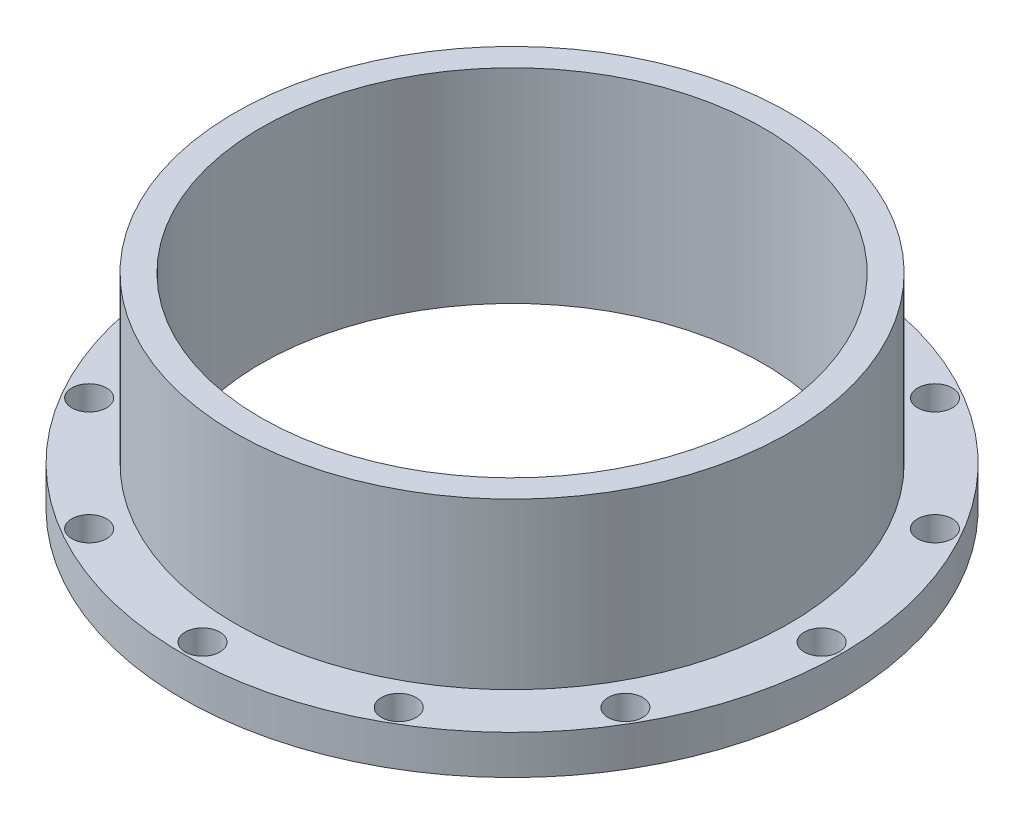
ISO-10303-21;
HEADER;
FILE_DESCRIPTION(('STEP AP214'),'2;1');
FILE_NAME('part.step','',(''),(''),'','','');
FILE_SCHEMA(('AUTOMOTIVE_DESIGN { 1 0 10303 214 1 1 1 1 }'));
ENDSEC;
DATA;
#1=APPLICATION_CONTEXT('core data for automotive mechanical design processes');
#2=APPLICATION_PROTOCOL_DEFINITION('international standard','automotive_design',2000,#1);
#3=PRODUCT_CONTEXT('',#1,'mechanical');
#4=PRODUCT('Part','Part','',(#3));
#5=PRODUCT_RELATED_PRODUCT_CATEGORY('part','',(#4));
#6=PRODUCT_DEFINITION_FORMATION('','',#4);
#7=PRODUCT_DEFINITION_CONTEXT('part definition',#1,'design');
#8=PRODUCT_DEFINITION('design','',#6,#7);
#9=PRODUCT_DEFINITION_SHAPE('','',#8);
#10=(LENGTH_UNIT() NAMED_UNIT(*) SI_UNIT(.MILLI.,.METRE.));
#11=(NAMED_UNIT(*) PLANE_ANGLE_UNIT() SI_UNIT($,.RADIAN.));
#12=(NAMED_UNIT(*) SI_UNIT($,.STERADIAN.) SOLID_ANGLE_UNIT());
#13=UNCERTAINTY_MEASURE_WITH_UNIT(LENGTH_MEASURE(1.E-05),#10,'distance_accuracy_value','');
#14=(GEOMETRIC_REPRESENTATION_CONTEXT(3) GLOBAL_UNCERTAINTY_ASSIGNED_CONTEXT((#13)) GLOBAL_UNIT_ASSIGNED_CONTEXT((#10,
#11,#12)) REPRESENTATION_CONTEXT('',''));
#15=CARTESIAN_POINT('',(0.,0.,0.));
#16=DIRECTION('',(0.,0.,1.));
#17=DIRECTION('',(1.,0.,0.));
#18=AXIS2_PLACEMENT_3D('',#15,#16,#17);
#19=CARTESIAN_POINT('',(0.,30.48,0.));
#20=DIRECTION('',(0.,-1.,0.));
#21=DIRECTION('',(0.,0.,-1.));
#22=AXIS2_PLACEMENT_3D('',#19,#20,#21);
#23=CYLINDRICAL_SURFACE('',#22,49.2125);
#24=CARTESIAN_POINT('',(0.,0.,0.));
#25=DIRECTION('',(0.,1.,0.));
#26=DIRECTION('',(0.,0.,1.));
#27=AXIS2_PLACEMENT_3D('',#24,#25,#26);
#28=CIRCLE('',#27,49.2125);
#29=CARTESIAN_POINT('',(0.,0.,-49.2125));
#30=VERTEX_POINT('',#29);
#31=EDGE_CURVE('E11',#30,#30,#28,.T.);
#32=CARTESIAN_POINT('',(0.,5.842,0.));
#33=DIRECTION('',(0.,1.,0.));
#34=DIRECTION('',(0.,0.,1.));
#35=AXIS2_PLACEMENT_3D('',#32,#33,#34);
#36=CIRCLE('',#35,49.2125);
#37=CARTESIAN_POINT('',(0.,5.84199999999999,-49.2125));
#38=VERTEX_POINT('',#37);
#39=EDGE_CURVE('E49',#38,#38,#36,.T.);
#40=CARTESIAN_POINT('',(0.,0.,-49.2125));
#41=CARTESIAN_POINT('',(0.,0.0608541666666669,-49.2125));
#42=CARTESIAN_POINT('',(0.,0.121708333333334,-49.2125));
#43=CARTESIAN_POINT('',(0.,0.243416666666667,-49.2125));
#44=CARTESIAN_POINT('',(0.,0.304270833333334,-49.2125));
#45=CARTESIAN_POINT('',(0.,0.425979166666667,-49.2125));
#46=CARTESIAN_POINT('',(0.,0.486833333333332,-49.2125));
#47=CARTESIAN_POINT('',(0.,0.608541666666665,-49.2125));
#48=CARTESIAN_POINT('',(0.,0.669395833333331,-49.2125));
#49=CARTESIAN_POINT('',(0.,0.791104166666665,-49.2125));
#50=CARTESIAN_POINT('',(0.,0.851958333333332,-49.2125));
#51=CARTESIAN_POINT('',(0.,0.973666666666666,-49.2125));
#52=CARTESIAN_POINT('',(0.,1.03452083333333,-49.2125));
#53=CARTESIAN_POINT('',(0.,1.15622916666667,-49.2125));
#54=CARTESIAN_POINT('',(0.,1.21708333333333,-49.2125));
#55=CARTESIAN_POINT('',(0.,1.33879166666667,-49.2125));
#56=CARTESIAN_POINT('',(0.,1.39964583333333,-49.2125));
#57=CARTESIAN_POINT('',(0.,1.52135416666666,-49.2125));
#58=CARTESIAN_POINT('',(0.,1.58220833333333,-49.2125));
#59=CARTESIAN_POINT('',(0.,1.70391666666666,-49.2125));
#60=CARTESIAN_POINT('',(0.,1.76477083333333,-49.2125));
#61=CARTESIAN_POINT('',(0.,1.88647916666666,-49.2125));
#62=CARTESIAN_POINT('',(0.,1.94733333333333,-49.2125));
#63=CARTESIAN_POINT('',(0.,2.06904166666666,-49.2125));
#64=CARTESIAN_POINT('',(0.,2.12989583333333,-49.2125));
#65=CARTESIAN_POINT('',(0.,2.25160416666666,-49.2125));
#66=CARTESIAN_POINT('',(0.,2.31245833333333,-49.2125));
#67=CARTESIAN_POINT('',(0.,2.43416666666666,-49.2125));
#68=CARTESIAN_POINT('',(0.,2.49502083333333,-49.2125));
#69=CARTESIAN_POINT('',(0.,2.61672916666666,-49.2125));
#70=CARTESIAN_POINT('',(0.,2.67758333333333,-49.2125));
#71=CARTESIAN_POINT('',(0.,2.79929166666666,-49.2125));
#72=CARTESIAN_POINT('',(0.,2.86014583333333,-49.2125));
#73=CARTESIAN_POINT('',(0.,2.98185416666666,-49.2125));
#74=CARTESIAN_POINT('',(0.,3.04270833333333,-49.2125));
#75=CARTESIAN_POINT('',(0.,3.16441666666666,-49.2125));
#76=CARTESIAN_POINT('',(0.,3.22527083333333,-49.2125));
#77=CARTESIAN_POINT('',(0.,3.34697916666666,-49.2125));
#78=CARTESIAN_POINT('',(0.,3.40783333333333,-49.2125));
#79=CARTESIAN_POINT('',(0.,3.52954166666666,-49.2125));
#80=CARTESIAN_POINT('',(0.,3.59039583333333,-49.2125));
#81=CARTESIAN_POINT('',(0.,3.71210416666666,-49.2125));
#82=CARTESIAN_POINT('',(0.,3.77295833333333,-49.2125));
#83=CARTESIAN_POINT('',(0.,3.89466666666666,-49.2125));
#84=CARTESIAN_POINT('',(0.,3.95552083333333,-49.2125));
#85=CARTESIAN_POINT('',(0.,4.07722916666666,-49.2125));
#86=CARTESIAN_POINT('',(0.,4.13808333333333,-49.2125));
#87=CARTESIAN_POINT('',(0.,4.25979166666666,-49.2125));
#88=CARTESIAN_POINT('',(0.,4.32064583333333,-49.2125));
#89=CARTESIAN_POINT('',(0.,4.44235416666666,-49.2125));
#90=CARTESIAN_POINT('',(0.,4.50320833333333,-49.2125));
#91=CARTESIAN_POINT('',(0.,4.62491666666666,-49.2125));
#92=CARTESIAN_POINT('',(0.,4.68577083333333,-49.2125));
#93=CARTESIAN_POINT('',(0.,4.80747916666666,-49.2125));
#94=CARTESIAN_POINT('',(0.,4.86833333333333,-49.2125));
#95=CARTESIAN_POINT('',(0.,4.99004166666666,-49.2125));
#96=CARTESIAN_POINT('',(0.,5.05089583333333,-49.2125));
#97=CARTESIAN_POINT('',(0.,5.17260416666666,-49.2125));
#98=CARTESIAN_POINT('',(0.,5.23345833333333,-49.2125));
#99=CARTESIAN_POINT('',(0.,5.35516666666666,-49.2125));
#100=CARTESIAN_POINT('',(0.,5.41602083333333,-49.2125));
#101=CARTESIAN_POINT('',(0.,5.53772916666666,-49.2125));
#102=CARTESIAN_POINT('',(0.,5.59858333333333,-49.2125));
#103=CARTESIAN_POINT('',(0.,5.72029166666666,-49.2125));
#104=CARTESIAN_POINT('',(0.,5.78114583333333,-49.2125));
#105=CARTESIAN_POINT('',(0.,5.84199999999999,-49.2125));
#106=B_SPLINE_CURVE_WITH_KNOTS('',3,(#40,#41,#42,#43,#44,#45,#46,#47,#48,#49,#50,#51,#52,#53,
#54,#55,#56,#57,#58,#59,#60,#61,#62,#63,#64,#65,#66,#67,#68,#69,#70,#71,#72,#73,#74,#75,#76,#77,
#78,#79,#80,#81,#82,#83,#84,#85,#86,#87,#88,#89,#90,#91,#92,#93,#94,#95,#96,#97,#98,#99,#100,
#101,#102,#103,#104,#105),.UNSPECIFIED.,.F.,.F.,(4,2,2,2,2,2,2,2,2,2,2,2,2,2,2,2,2,2,2,2,2,2,2,
2,2,2,2,2,2,2,2,2,4),(0.,0.1825625,0.365125000000001,0.547687499999998,0.730249999999998,
0.912812499999999,1.095375,1.2779375,1.4605,1.6430625,1.825625,2.0081875,2.19075,2.3733125,
2.555875,2.7384375,2.921,3.1035625,3.286125,3.4686875,3.65124999999999,3.8338125,4.016375,
4.1989375,4.3815,4.56406249999999,4.74662499999999,4.92918749999999,5.11174999999999,
5.29431249999999,5.47687499999999,5.65943749999999,5.84199999999999),.UNSPECIFIED.);
#107=EDGE_CURVE('BSEAM46',#30,#38,#106,.T.);
#108=ORIENTED_EDGE('',*,*,#31,.T.);
#109=ORIENTED_EDGE('',*,*,#39,.F.);
#110=ORIENTED_EDGE('',*,*,#107,.T.);
#111=ORIENTED_EDGE('',*,*,#107,.F.);
#112=EDGE_LOOP('',(#108,#110,#109,#111));
#113=FACE_BOUND('',#112,.T.);
#114=ADVANCED_FACE('F46',(#113),#23,.T.);
#115=CARTESIAN_POINT('',(0.,0.,0.));
#116=DIRECTION('',(0.,1.,0.));
#117=DIRECTION('',(0.,0.,1.));
#118=AXIS2_PLACEMENT_3D('',#115,#116,#117);
#119=PLANE('',#118);
#120=CARTESIAN_POINT('',(-23.1139999999995,0.,-40.0346223661473));
#121=DIRECTION('',(0.,1.,0.));
#122=DIRECTION('',(0.,0.,1.));
#123=AXIS2_PLACEMENT_3D('',#120,#121,#122);
#124=CIRCLE('',#123,2.5908);
#125=CARTESIAN_POINT('',(-23.1139999999995,0.,-37.4438223661473));
#126=VERTEX_POINT('',#125);
#127=EDGE_CURVE('E163',#126,#126,#124,.T.);
#128=ORIENTED_EDGE('',*,*,#127,.T.);
#129=EDGE_LOOP('',(#128));
#130=FACE_BOUND('',#129,.T.);
#131=CARTESIAN_POINT('',(-40.0346223661468,0.,-23.1140000000005));
#132=DIRECTION('',(0.,1.,0.));
#133=DIRECTION('',(0.,0.,1.));
#134=AXIS2_PLACEMENT_3D('',#131,#132,#133);
#135=CIRCLE('',#134,2.5908);
#136=CARTESIAN_POINT('',(-40.0346223661468,0.,-20.5232000000005));
#137=VERTEX_POINT('',#136);
#138=EDGE_CURVE('E155',#137,#137,#135,.T.);
#139=ORIENTED_EDGE('',*,*,#138,.T.);
#140=EDGE_LOOP('',(#139));
#141=FACE_BOUND('',#140,.T.);
#142=CARTESIAN_POINT('',(-46.228,0.,-4.84212597996121E-13));
#143=DIRECTION('',(0.,1.,0.));
#144=DIRECTION('',(0.,0.,1.));
#145=AXIS2_PLACEMENT_3D('',#142,#143,#144);
#146=CIRCLE('',#145,2.5908);
#147=CARTESIAN_POINT('',(-46.228,0.,2.59079999999951));
#148=VERTEX_POINT('',#147);
#149=EDGE_CURVE('E147',#148,#148,#146,.T.);
#150=ORIENTED_EDGE('',*,*,#149,.T.);
#151=EDGE_LOOP('',(#150));
#152=FACE_BOUND('',#151,.T.);
#153=CARTESIAN_POINT('',(-40.0346223661472,0.,23.1139999999996));
#154=DIRECTION('',(0.,1.,0.));
#155=DIRECTION('',(0.,0.,1.));
#156=AXIS2_PLACEMENT_3D('',#153,#154,#155);
#157=CIRCLE('',#156,2.5908);
#158=CARTESIAN_POINT('',(-40.0346223661472,0.,25.7047999999996));
#159=VERTEX_POINT('',#158);
#160=EDGE_CURVE('E139',#159,#159,#157,.T.);
#161=ORIENTED_EDGE('',*,*,#160,.T.);
#162=EDGE_LOOP('',(#161));
#163=FACE_BOUND('',#162,.T.);
#164=CARTESIAN_POINT('',(-23.1140000000003,0.,40.0346223661468));
#165=DIRECTION('',(0.,1.,0.));
#166=DIRECTION('',(0.,0.,1.));
#167=AXIS2_PLACEMENT_3D('',#164,#165,#166);
#168=CIRCLE('',#167,2.5908);
#169=CARTESIAN_POINT('',(-23.1140000000003,0.,42.6254223661468));
#170=VERTEX_POINT('',#169);
#171=EDGE_CURVE('E131',#170,#170,#168,.T.);
#172=ORIENTED_EDGE('',*,*,#171,.T.);
#173=EDGE_LOOP('',(#172));
#174=FACE_BOUND('',#173,.T.);
#175=CARTESIAN_POINT('',(0.,0.,46.228));
#176=DIRECTION('',(0.,1.,0.));
#177=DIRECTION('',(0.,0.,1.));
#178=AXIS2_PLACEMENT_3D('',#175,#176,#177);
#179=CIRCLE('',#178,2.5908);
#180=CARTESIAN_POINT('',(0.,0.,48.8188));
#181=VERTEX_POINT('',#180);
#182=EDGE_CURVE('E123',#181,#181,#179,.T.);
#183=ORIENTED_EDGE('',*,*,#182,.T.);
#184=EDGE_LOOP('',(#183));
#185=FACE_BOUND('',#184,.T.);
#186=CARTESIAN_POINT('',(23.1139999999998,0.,40.0346223661472));
#187=DIRECTION('',(0.,1.,0.));
#188=DIRECTION('',(0.,0.,1.));
#189=AXIS2_PLACEMENT_3D('',#186,#187,#188);
#190=CIRCLE('',#189,2.5908);
#191=CARTESIAN_POINT('',(23.1139999999998,0.,42.6254223661472));
#192=VERTEX_POINT('',#191);
#193=EDGE_CURVE('E115',#192,#192,#190,.T.);
#194=ORIENTED_EDGE('',*,*,#193,.T.);
#195=EDGE_LOOP('',(#194));
#196=FACE_BOUND('',#195,.T.);
#197=CARTESIAN_POINT('',(40.0346223661469,0.,23.1140000000002));
#198=DIRECTION('',(0.,1.,0.));
#199=DIRECTION('',(0.,0.,1.));
#200=AXIS2_PLACEMENT_3D('',#197,#198,#199);
#201=CIRCLE('',#200,2.5908);
#202=CARTESIAN_POINT('',(40.0346223661469,0.,25.7048000000002));
#203=VERTEX_POINT('',#202);
#204=EDGE_CURVE('E107',#203,#203,#201,.T.);
#205=ORIENTED_EDGE('',*,*,#204,.T.);
#206=EDGE_LOOP('',(#205));
#207=FACE_BOUND('',#206,.T.);
#208=CARTESIAN_POINT('',(46.228,0.,1.6140419933204E-13));
#209=DIRECTION('',(0.,1.,0.));
#210=DIRECTION('',(0.,0.,1.));
#211=AXIS2_PLACEMENT_3D('',#208,#209,#210);
#212=CIRCLE('',#211,2.5908);
#213=CARTESIAN_POINT('',(46.228,0.,2.59080000000016));
#214=VERTEX_POINT('',#213);
#215=EDGE_CURVE('E99',#214,#214,#212,.T.);
#216=ORIENTED_EDGE('',*,*,#215,.T.);
#217=EDGE_LOOP('',(#216));
#218=FACE_BOUND('',#217,.T.);
#219=CARTESIAN_POINT('',(40.0346223661471,0.,-23.1139999999999));
#220=DIRECTION('',(0.,1.,0.));
#221=DIRECTION('',(0.,0.,1.));
#222=AXIS2_PLACEMENT_3D('',#219,#220,#221);
#223=CIRCLE('',#222,2.5908);
#224=CARTESIAN_POINT('',(40.0346223661471,0.,-20.5231999999999));
#225=VERTEX_POINT('',#224);
#226=EDGE_CURVE('E91',#225,#225,#223,.T.);
#227=ORIENTED_EDGE('',*,*,#226,.T.);
#228=EDGE_LOOP('',(#227));
#229=FACE_BOUND('',#228,.T.);
#230=CARTESIAN_POINT('',(23.114,0.,-40.034622366147));
#231=DIRECTION('',(0.,1.,0.));
#232=DIRECTION('',(0.,0.,1.));
#233=AXIS2_PLACEMENT_3D('',#230,#231,#232);
#234=CIRCLE('',#233,2.5908);
#235=CARTESIAN_POINT('',(23.114,0.,-37.443822366147));
#236=VERTEX_POINT('',#235);
#237=EDGE_CURVE('E83',#236,#236,#234,.T.);
#238=ORIENTED_EDGE('',*,*,#237,.T.);
#239=EDGE_LOOP('',(#238));
#240=FACE_BOUND('',#239,.T.);
#241=CARTESIAN_POINT('',(0.,0.,-46.228));
#242=DIRECTION('',(0.,1.,0.));
#243=DIRECTION('',(0.,0.,1.));
#244=AXIS2_PLACEMENT_3D('',#241,#242,#243);
#245=CIRCLE('',#244,2.5908);
#246=CARTESIAN_POINT('',(0.,0.,-43.6372));
#247=VERTEX_POINT('',#246);
#248=EDGE_CURVE('E72',#247,#247,#245,.T.);
#249=ORIENTED_EDGE('',*,*,#248,.T.);
#250=EDGE_LOOP('',(#249));
#251=FACE_BOUND('',#250,.T.);
#252=CARTESIAN_POINT('',(0.,0.,0.));
#253=DIRECTION('',(0.,1.,0.));
#254=DIRECTION('',(0.,0.,1.));
#255=AXIS2_PLACEMENT_3D('',#252,#253,#254);
#256=CIRCLE('',#255,37.5);
#257=CARTESIAN_POINT('',(0.,0.,37.5));
#258=VERTEX_POINT('',#257);
#259=EDGE_CURVE('E64',#258,#258,#256,.T.);
#260=ORIENTED_EDGE('',*,*,#259,.T.);
#261=EDGE_LOOP('',(#260));
#262=FACE_BOUND('',#261,.T.);
#263=ORIENTED_EDGE('',*,*,#31,.F.);
#264=EDGE_LOOP('',(#263));
#265=FACE_BOUND('',#264,.T.);
#266=ADVANCED_FACE('F178',(#130,#141,#152,#163,#174,#185,#196,#207,#218,#229,#240,#251,#262,
#265),#119,.F.);
#267=CARTESIAN_POINT('',(0.,5.842,0.));
#268=DIRECTION('',(0.,1.,0.));
#269=DIRECTION('',(0.,0.,1.));
#270=AXIS2_PLACEMENT_3D('',#267,#268,#269);
#271=PLANE('',#270);
#272=CARTESIAN_POINT('',(-23.1139999999995,5.842,-40.0346223661473));
#273=DIRECTION('',(0.,1.,0.));
#274=DIRECTION('',(0.,0.,1.));
#275=AXIS2_PLACEMENT_3D('',#272,#273,#274);
#276=CIRCLE('',#275,2.59079999999999);
#277=CARTESIAN_POINT('',(-23.1139999999995,5.842,-37.4438223661473));
#278=VERTEX_POINT('',#277);
#279=EDGE_CURVE('E167',#278,#278,#276,.T.);
#280=ORIENTED_EDGE('',*,*,#279,.F.);
#281=EDGE_LOOP('',(#280));
#282=FACE_BOUND('',#281,.T.);
#283=CARTESIAN_POINT('',(-40.0346223661468,5.842,-23.1140000000005));
#284=DIRECTION('',(0.,1.,0.));
#285=DIRECTION('',(0.,0.,1.));
#286=AXIS2_PLACEMENT_3D('',#283,#284,#285);
#287=CIRCLE('',#286,2.59079999999999);
#288=CARTESIAN_POINT('',(-40.0346223661468,5.842,-20.5232000000005));
#289=VERTEX_POINT('',#288);
#290=EDGE_CURVE('E159',#289,#289,#287,.T.);
#291=ORIENTED_EDGE('',*,*,#290,.F.);
#292=EDGE_LOOP('',(#291));
#293=FACE_BOUND('',#292,.T.);
#294=CARTESIAN_POINT('',(-46.228,5.842,-4.84212597996121E-13));
#295=DIRECTION('',(0.,1.,0.));
#296=DIRECTION('',(0.,0.,1.));
#297=AXIS2_PLACEMENT_3D('',#294,#295,#296);
#298=CIRCLE('',#297,2.59079999999998);
#299=CARTESIAN_POINT('',(-46.228,5.842,2.5907999999995));
#300=VERTEX_POINT('',#299);
#301=EDGE_CURVE('E151',#300,#300,#298,.T.);
#302=ORIENTED_EDGE('',*,*,#301,.F.);
#303=EDGE_LOOP('',(#302));
#304=FACE_BOUND('',#303,.T.);
#305=CARTESIAN_POINT('',(-40.0346223661472,5.842,23.1139999999996));
#306=DIRECTION('',(0.,1.,0.));
#307=DIRECTION('',(0.,0.,1.));
#308=AXIS2_PLACEMENT_3D('',#305,#306,#307);
#309=CIRCLE('',#308,2.59079999999999);
#310=CARTESIAN_POINT('',(-40.0346223661472,5.842,25.7047999999996));
#311=VERTEX_POINT('',#310);
#312=EDGE_CURVE('E143',#311,#311,#309,.T.);
#313=ORIENTED_EDGE('',*,*,#312,.F.);
#314=EDGE_LOOP('',(#313));
#315=FACE_BOUND('',#314,.T.);
#316=CARTESIAN_POINT('',(-23.1140000000003,5.842,40.0346223661468));
#317=DIRECTION('',(0.,1.,0.));
#318=DIRECTION('',(0.,0.,1.));
#319=AXIS2_PLACEMENT_3D('',#316,#317,#318);
#320=CIRCLE('',#319,2.59079999999999);
#321=CARTESIAN_POINT('',(-23.1140000000003,5.842,42.6254223661468));
#322=VERTEX_POINT('',#321);
#323=EDGE_CURVE('E135',#322,#322,#320,.T.);
#324=ORIENTED_EDGE('',*,*,#323,.F.);
#325=EDGE_LOOP('',(#324));
#326=FACE_BOUND('',#325,.T.);
#327=CARTESIAN_POINT('',(0.,5.842,46.228));
#328=DIRECTION('',(0.,1.,0.));
#329=DIRECTION('',(0.,0.,1.));
#330=AXIS2_PLACEMENT_3D('',#327,#328,#329);
#331=CIRCLE('',#330,2.59079999999999);
#332=CARTESIAN_POINT('',(0.,5.842,48.8188));
#333=VERTEX_POINT('',#332);
#334=EDGE_CURVE('E127',#333,#333,#331,.T.);
#335=ORIENTED_EDGE('',*,*,#334,.F.);
#336=EDGE_LOOP('',(#335));
#337=FACE_BOUND('',#336,.T.);
#338=CARTESIAN_POINT('',(23.1139999999998,5.842,40.0346223661472));
#339=DIRECTION('',(0.,1.,0.));
#340=DIRECTION('',(0.,0.,1.));
#341=AXIS2_PLACEMENT_3D('',#338,#339,#340);
#342=CIRCLE('',#341,2.59079999999999);
#343=CARTESIAN_POINT('',(23.1139999999998,5.842,42.6254223661471));
#344=VERTEX_POINT('',#343);
#345=EDGE_CURVE('E119',#344,#344,#342,.T.);
#346=ORIENTED_EDGE('',*,*,#345,.F.);
#347=EDGE_LOOP('',(#346));
#348=FACE_BOUND('',#347,.T.);
#349=CARTESIAN_POINT('',(40.0346223661469,5.842,23.1140000000002));
#350=DIRECTION('',(0.,1.,0.));
#351=DIRECTION('',(0.,0.,1.));
#352=AXIS2_PLACEMENT_3D('',#349,#350,#351);
#353=CIRCLE('',#352,2.59079999999998);
#354=CARTESIAN_POINT('',(40.0346223661469,5.842,25.7048000000002));
#355=VERTEX_POINT('',#354);
#356=EDGE_CURVE('E111',#355,#355,#353,.T.);
#357=ORIENTED_EDGE('',*,*,#356,.F.);
#358=EDGE_LOOP('',(#357));
#359=FACE_BOUND('',#358,.T.);
#360=CARTESIAN_POINT('',(46.228,5.842,1.6140419933204E-13));
#361=DIRECTION('',(0.,1.,0.));
#362=DIRECTION('',(0.,0.,1.));
#363=AXIS2_PLACEMENT_3D('',#360,#361,#362);
#364=CIRCLE('',#363,2.59079999999998);
#365=CARTESIAN_POINT('',(46.228,5.842,2.59080000000014));
#366=VERTEX_POINT('',#365);
#367=EDGE_CURVE('E103',#366,#366,#364,.T.);
#368=ORIENTED_EDGE('',*,*,#367,.F.);
#369=EDGE_LOOP('',(#368));
#370=FACE_BOUND('',#369,.T.);
#371=CARTESIAN_POINT('',(40.0346223661471,5.842,-23.1139999999999));
#372=DIRECTION('',(0.,1.,0.));
#373=DIRECTION('',(0.,0.,1.));
#374=AXIS2_PLACEMENT_3D('',#371,#372,#373);
#375=CIRCLE('',#374,2.59079999999998);
#376=CARTESIAN_POINT('',(40.0346223661471,5.842,-20.5231999999999));
#377=VERTEX_POINT('',#376);
#378=EDGE_CURVE('E95',#377,#377,#375,.T.);
#379=ORIENTED_EDGE('',*,*,#378,.F.);
#380=EDGE_LOOP('',(#379));
#381=FACE_BOUND('',#380,.T.);
#382=CARTESIAN_POINT('',(23.114,5.842,-40.034622366147));
#383=DIRECTION('',(0.,1.,0.));
#384=DIRECTION('',(0.,0.,1.));
#385=AXIS2_PLACEMENT_3D('',#382,#383,#384);
#386=CIRCLE('',#385,2.59079999999999);
#387=CARTESIAN_POINT('',(23.114,5.842,-37.443822366147));
#388=VERTEX_POINT('',#387);
#389=EDGE_CURVE('E87',#388,#388,#386,.T.);
#390=ORIENTED_EDGE('',*,*,#389,.F.);
#391=EDGE_LOOP('',(#390));
#392=FACE_BOUND('',#391,.T.);
#393=CARTESIAN_POINT('',(0.,5.842,-46.228));
#394=DIRECTION('',(0.,1.,0.));
#395=DIRECTION('',(0.,0.,1.));
#396=AXIS2_PLACEMENT_3D('',#393,#394,#395);
#397=CIRCLE('',#396,2.59079999999999);
#398=CARTESIAN_POINT('',(0.,5.842,-43.6372));
#399=VERTEX_POINT('',#398);
#400=EDGE_CURVE('E79',#399,#399,#397,.T.);
#401=ORIENTED_EDGE('',*,*,#400,.F.);
#402=EDGE_LOOP('',(#401));
#403=FACE_BOUND('',#402,.T.);
#404=CARTESIAN_POINT('',(0.,5.842,0.));
#405=DIRECTION('',(0.,1.,0.));
#406=DIRECTION('',(0.,0.,1.));
#407=AXIS2_PLACEMENT_3D('',#404,#405,#406);
#408=CIRCLE('',#407,41.402);
#409=CARTESIAN_POINT('',(0.,5.842,41.402));
#410=VERTEX_POINT('',#409);
#411=EDGE_CURVE('E58',#410,#410,#408,.T.);
#412=ORIENTED_EDGE('',*,*,#411,.F.);
#413=EDGE_LOOP('',(#412));
#414=FACE_BOUND('',#413,.T.);
#415=ORIENTED_EDGE('',*,*,#39,.T.);
#416=EDGE_LOOP('',(#415));
#417=FACE_BOUND('',#416,.T.);
#418=ADVANCED_FACE('F174',(#282,#293,#304,#315,#326,#337,#348,#359,#370,#381,#392,#403,#414,
#417),#271,.T.);
#419=CARTESIAN_POINT('',(0.,5.842,0.));
#420=DIRECTION('',(0.,1.,0.));
#421=DIRECTION('',(0.,0.,1.));
#422=AXIS2_PLACEMENT_3D('',#419,#420,#421);
#423=CYLINDRICAL_SURFACE('',#422,41.402);
#424=CARTESIAN_POINT('',(0.,30.48,0.));
#425=DIRECTION('',(0.,1.,0.));
#426=DIRECTION('',(0.,0.,1.));
#427=AXIS2_PLACEMENT_3D('',#424,#425,#426);
#428=CIRCLE('',#427,41.402);
#429=CARTESIAN_POINT('',(0.,30.48,41.402));
#430=VERTEX_POINT('',#429);
#431=EDGE_CURVE('E60',#430,#430,#428,.T.);
#432=CARTESIAN_POINT('',(0.,5.842,41.402));
#433=CARTESIAN_POINT('',(0.,6.09864583333333,41.402));
#434=CARTESIAN_POINT('',(0.,6.35529166666666,41.402));
#435=CARTESIAN_POINT('',(0.,6.86858333333333,41.402));
#436=CARTESIAN_POINT('',(0.,7.12522916666666,41.402));
#437=CARTESIAN_POINT('',(0.,7.63852083333333,41.402));
#438=CARTESIAN_POINT('',(0.,7.89516666666666,41.402));
#439=CARTESIAN_POINT('',(0.,8.40845833333333,41.402));
#440=CARTESIAN_POINT('',(0.,8.66510416666666,41.402));
#441=CARTESIAN_POINT('',(0.,9.17839583333333,41.402));
#442=CARTESIAN_POINT('',(0.,9.43504166666666,41.402));
#443=CARTESIAN_POINT('',(0.,9.94833333333333,41.402));
#444=CARTESIAN_POINT('',(0.,10.2049791666667,41.402));
#445=CARTESIAN_POINT('',(0.,10.7182708333333,41.402));
#446=CARTESIAN_POINT('',(0.,10.9749166666667,41.402));
#447=CARTESIAN_POINT('',(0.,11.4882083333333,41.402));
#448=CARTESIAN_POINT('',(0.,11.7448541666667,41.402));
#449=CARTESIAN_POINT('',(0.,12.2581458333333,41.402));
#450=CARTESIAN_POINT('',(0.,12.5147916666667,41.402));
#451=CARTESIAN_POINT('',(0.,13.0280833333333,41.402));
#452=CARTESIAN_POINT('',(0.,13.2847291666667,41.402));
#453=CARTESIAN_POINT('',(0.,13.7980208333333,41.402));
#454=CARTESIAN_POINT('',(0.,14.0546666666667,41.402));
#455=CARTESIAN_POINT('',(0.,14.5679583333333,41.402));
#456=CARTESIAN_POINT('',(0.,14.8246041666667,41.402));
#457=CARTESIAN_POINT('',(0.,15.3378958333333,41.402));
#458=CARTESIAN_POINT('',(0.,15.5945416666667,41.402));
#459=CARTESIAN_POINT('',(0.,16.1078333333333,41.402));
#460=CARTESIAN_POINT('',(0.,16.3644791666667,41.402));
#461=CARTESIAN_POINT('',(0.,16.8777708333333,41.402));
#462=CARTESIAN_POINT('',(0.,17.1344166666667,41.402));
#463=CARTESIAN_POINT('',(0.,17.6477083333333,41.402));
#464=CARTESIAN_POINT('',(0.,17.9043541666667,41.402));
#465=CARTESIAN_POINT('',(0.,18.4176458333333,41.402));
#466=CARTESIAN_POINT('',(0.,18.6742916666667,41.402));
#467=CARTESIAN_POINT('',(0.,19.1875833333333,41.402));
#468=CARTESIAN_POINT('',(0.,19.4442291666667,41.402));
#469=CARTESIAN_POINT('',(0.,19.9575208333333,41.402));
#470=CARTESIAN_POINT('',(0.,20.2141666666667,41.402));
#471=CARTESIAN_POINT('',(0.,20.7274583333333,41.402));
#472=CARTESIAN_POINT('',(0.,20.9841041666667,41.402));
#473=CARTESIAN_POINT('',(0.,21.4973958333333,41.402));
#474=CARTESIAN_POINT('',(0.,21.7540416666667,41.402));
#475=CARTESIAN_POINT('',(0.,22.2673333333333,41.402));
#476=CARTESIAN_POINT('',(0.,22.5239791666667,41.402));
#477=CARTESIAN_POINT('',(0.,23.0372708333333,41.402));
#478=CARTESIAN_POINT('',(0.,23.2939166666667,41.402));
#479=CARTESIAN_POINT('',(0.,23.8072083333333,41.402));
#480=CARTESIAN_POINT('',(0.,24.0638541666667,41.402));
#481=CARTESIAN_POINT('',(0.,24.5771458333333,41.402));
#482=CARTESIAN_POINT('',(0.,24.8337916666667,41.402));
#483=CARTESIAN_POINT('',(0.,25.3470833333333,41.402));
#484=CARTESIAN_POINT('',(0.,25.6037291666667,41.402));
#485=CARTESIAN_POINT('',(0.,26.1170208333333,41.402));
#486=CARTESIAN_POINT('',(0.,26.3736666666667,41.402));
#487=CARTESIAN_POINT('',(0.,26.8869583333333,41.402));
#488=CARTESIAN_POINT('',(0.,27.1436041666667,41.402));
#489=CARTESIAN_POINT('',(0.,27.6568958333333,41.402));
#490=CARTESIAN_POINT('',(0.,27.9135416666667,41.402));
#491=CARTESIAN_POINT('',(0.,28.4268333333333,41.402));
#492=CARTESIAN_POINT('',(0.,28.6834791666667,41.402));
#493=CARTESIAN_POINT('',(0.,29.1967708333333,41.402));
#494=CARTESIAN_POINT('',(0.,29.4534166666667,41.402));
#495=CARTESIAN_POINT('',(0.,29.9667083333333,41.402));
#496=CARTESIAN_POINT('',(0.,30.2233541666667,41.402));
#497=CARTESIAN_POINT('',(0.,30.48,41.402));
#498=B_SPLINE_CURVE_WITH_KNOTS('',3,(#432,#433,#434,#435,#436,#437,#438,#439,#440,#441,#442,
#443,#444,#445,#446,#447,#448,#449,#450,#451,#452,#453,#454,#455,#456,#457,#458,#459,#460,#461,
#462,#463,#464,#465,#466,#467,#468,#469,#470,#471,#472,#473,#474,#475,#476,#477,#478,#479,#480,
#481,#482,#483,#484,#485,#486,#487,#488,#489,#490,#491,#492,#493,#494,#495,#496,#497),
.UNSPECIFIED.,.F.,.F.,(4,2,2,2,2,2,2,2,2,2,2,2,2,2,2,2,2,2,2,2,2,2,2,2,2,2,2,2,2,2,2,2,4),(0.,
0.769937500000001,1.539875,2.3098125,3.07975,3.8496875,4.619625,5.3895625,6.1595,6.9294375,
7.699375,8.4693125,9.23925,10.0091875,10.779125,11.5490625,12.319,13.0889375,13.858875,
14.6288125,15.39875,16.1686875,16.938625,17.7085625,18.4785,19.2484375,20.018375,20.7883125,
21.55825,22.3281875,23.098125,23.8680625,24.638),.UNSPECIFIED.);
#499=EDGE_CURVE('BSEAM177',#410,#430,#498,.T.);
#500=ORIENTED_EDGE('',*,*,#411,.T.);
#501=ORIENTED_EDGE('',*,*,#431,.F.);
#502=ORIENTED_EDGE('',*,*,#499,.T.);
#503=ORIENTED_EDGE('',*,*,#499,.F.);
#504=EDGE_LOOP('',(#500,#502,#501,#503));
#505=FACE_BOUND('',#504,.T.);
#506=ADVANCED_FACE('F177',(#505),#423,.T.);
#507=CARTESIAN_POINT('',(0.,30.48,0.));
#508=DIRECTION('',(0.,1.,0.));
#509=DIRECTION('',(0.,0.,1.));
#510=AXIS2_PLACEMENT_3D('',#507,#508,#509);
#511=PLANE('',#510);
#512=CARTESIAN_POINT('',(0.,30.48,0.));
#513=DIRECTION('',(0.,1.,0.));
#514=DIRECTION('',(0.,0.,1.));
#515=AXIS2_PLACEMENT_3D('',#512,#513,#514);
#516=CIRCLE('',#515,37.5);
#517=CARTESIAN_POINT('',(0.,30.48,37.5));
#518=VERTEX_POINT('',#517);
#519=EDGE_CURVE('E68',#518,#518,#516,.T.);
#520=ORIENTED_EDGE('',*,*,#519,.F.);
#521=EDGE_LOOP('',(#520));
#522=FACE_BOUND('',#521,.T.);
#523=ORIENTED_EDGE('',*,*,#431,.T.);
#524=EDGE_LOOP('',(#523));
#525=FACE_BOUND('',#524,.T.);
#526=ADVANCED_FACE('F217',(#522,#525),#511,.T.);
#527=CARTESIAN_POINT('',(0.,0.,0.));
#528=DIRECTION('',(0.,1.,0.));
#529=DIRECTION('',(0.,0.,1.));
#530=AXIS2_PLACEMENT_3D('',#527,#528,#529);
#531=CYLINDRICAL_SURFACE('',#530,37.5);
#532=CARTESIAN_POINT('',(0.,0.,37.5));
#533=CARTESIAN_POINT('',(0.,0.317499999999999,37.5));
#534=CARTESIAN_POINT('',(0.,0.635,37.5));
#535=CARTESIAN_POINT('',(0.,1.27,37.5));
#536=CARTESIAN_POINT('',(0.,1.5875,37.5));
#537=CARTESIAN_POINT('',(0.,2.2225,37.5));
#538=CARTESIAN_POINT('',(0.,2.54,37.5));
#539=CARTESIAN_POINT('',(0.,3.175,37.5));
#540=CARTESIAN_POINT('',(0.,3.4925,37.5));
#541=CARTESIAN_POINT('',(0.,4.1275,37.5));
#542=CARTESIAN_POINT('',(0.,4.445,37.5));
#543=CARTESIAN_POINT('',(0.,5.08,37.5));
#544=CARTESIAN_POINT('',(0.,5.3975,37.5));
#545=CARTESIAN_POINT('',(0.,6.0325,37.5));
#546=CARTESIAN_POINT('',(0.,6.35,37.5));
#547=CARTESIAN_POINT('',(0.,6.985,37.5));
#548=CARTESIAN_POINT('',(0.,7.3025,37.5));
#549=CARTESIAN_POINT('',(0.,7.9375,37.5));
#550=CARTESIAN_POINT('',(0.,8.255,37.5));
#551=CARTESIAN_POINT('',(0.,8.89,37.5));
#552=CARTESIAN_POINT('',(0.,9.2075,37.5));
#553=CARTESIAN_POINT('',(0.,9.8425,37.5));
#554=CARTESIAN_POINT('',(0.,10.16,37.5));
#555=CARTESIAN_POINT('',(0.,10.795,37.5));
#556=CARTESIAN_POINT('',(0.,11.1125,37.5));
#557=CARTESIAN_POINT('',(0.,11.7475,37.5));
#558=CARTESIAN_POINT('',(0.,12.065,37.5));
#559=CARTESIAN_POINT('',(0.,12.7,37.5));
#560=CARTESIAN_POINT('',(0.,13.0175,37.5));
#561=CARTESIAN_POINT('',(0.,13.6525,37.5));
#562=CARTESIAN_POINT('',(0.,13.97,37.5));
#563=CARTESIAN_POINT('',(0.,14.605,37.5));
#564=CARTESIAN_POINT('',(0.,14.9225,37.5));
#565=CARTESIAN_POINT('',(0.,15.5575,37.5));
#566=CARTESIAN_POINT('',(0.,15.875,37.5));
#567=CARTESIAN_POINT('',(0.,16.51,37.5));
#568=CARTESIAN_POINT('',(0.,16.8275,37.5));
#569=CARTESIAN_POINT('',(0.,17.4625,37.5));
#570=CARTESIAN_POINT('',(0.,17.78,37.5));
#571=CARTESIAN_POINT('',(0.,18.415,37.5));
#572=CARTESIAN_POINT('',(0.,18.7325,37.5));
#573=CARTESIAN_POINT('',(0.,19.3675,37.5));
#574=CARTESIAN_POINT('',(0.,19.685,37.5));
#575=CARTESIAN_POINT('',(0.,20.32,37.5));
#576=CARTESIAN_POINT('',(0.,20.6375,37.5));
#577=CARTESIAN_POINT('',(0.,21.2725,37.5));
#578=CARTESIAN_POINT('',(0.,21.59,37.5));
#579=CARTESIAN_POINT('',(0.,22.225,37.5));
#580=CARTESIAN_POINT('',(0.,22.5425,37.5));
#581=CARTESIAN_POINT('',(0.,23.1775,37.5));
#582=CARTESIAN_POINT('',(0.,23.495,37.5));
#583=CARTESIAN_POINT('',(0.,24.13,37.5));
#584=CARTESIAN_POINT('',(0.,24.4475,37.5));
#585=CARTESIAN_POINT('',(0.,25.0825,37.5));
#586=CARTESIAN_POINT('',(0.,25.4,37.5));
#587=CARTESIAN_POINT('',(0.,26.035,37.5));
#588=CARTESIAN_POINT('',(0.,26.3525,37.5));
#589=CARTESIAN_POINT('',(0.,26.9875,37.5));
#590=CARTESIAN_POINT('',(0.,27.305,37.5));
#591=CARTESIAN_POINT('',(0.,27.94,37.5));
#592=CARTESIAN_POINT('',(0.,28.2575,37.5));
#593=CARTESIAN_POINT('',(0.,28.8925,37.5));
#594=CARTESIAN_POINT('',(0.,29.21,37.5));
#595=CARTESIAN_POINT('',(0.,29.845,37.5));
#596=CARTESIAN_POINT('',(0.,30.1625,37.5));
#597=CARTESIAN_POINT('',(0.,30.48,37.5));
#598=B_SPLINE_CURVE_WITH_KNOTS('',3,(#532,#533,#534,#535,#536,#537,#538,#539,#540,#541,#542,
#543,#544,#545,#546,#547,#548,#549,#550,#551,#552,#553,#554,#555,#556,#557,#558,#559,#560,#561,
#562,#563,#564,#565,#566,#567,#568,#569,#570,#571,#572,#573,#574,#575,#576,#577,#578,#579,#580,
#581,#582,#583,#584,#585,#586,#587,#588,#589,#590,#591,#592,#593,#594,#595,#596,#597),
.UNSPECIFIED.,.F.,.F.,(4,2,2,2,2,2,2,2,2,2,2,2,2,2,2,2,2,2,2,2,2,2,2,2,2,2,2,2,2,2,2,2,4),(0.,
0.9525,1.905,2.8575,3.81,4.7625,5.715,6.6675,7.62,8.5725,9.525,10.4775,11.43,12.3825,13.335,
14.2875,15.24,16.1925,17.145,18.0975,19.05,20.0025,20.955,21.9075,22.86,23.8125,24.765,25.7175,
26.67,27.6225,28.575,29.5275,30.48),.UNSPECIFIED.);
#599=EDGE_CURVE('BSEAM219',#258,#518,#598,.T.);
#600=ORIENTED_EDGE('',*,*,#259,.F.);
#601=ORIENTED_EDGE('',*,*,#519,.T.);
#602=ORIENTED_EDGE('',*,*,#599,.T.);
#603=ORIENTED_EDGE('',*,*,#599,.F.);
#604=EDGE_LOOP('',(#600,#602,#601,#603));
#605=FACE_BOUND('',#604,.T.);
#606=ADVANCED_FACE('F219',(#605),#531,.F.);
#607=CARTESIAN_POINT('',(0.,5.842,-46.228));
#608=DIRECTION('',(0.,1.,0.));
#609=DIRECTION('',(0.,0.,1.));
#610=AXIS2_PLACEMENT_3D('',#607,#608,#609);
#611=CYLINDRICAL_SURFACE('',#610,2.59079999999999);
#612=ORIENTED_EDGE('',*,*,#248,.F.);
#613=EDGE_LOOP('',(#612));
#614=FACE_BOUND('',#613,.T.);
#615=ORIENTED_EDGE('',*,*,#400,.T.);
#616=EDGE_LOOP('',(#615));
#617=FACE_BOUND('',#616,.T.);
#618=ADVANCED_FACE('F226',(#614,#617),#611,.F.);
#619=CARTESIAN_POINT('',(23.114,5.842,-40.034622366147));
#620=DIRECTION('',(0.,1.,0.));
#621=DIRECTION('',(0.,0.,1.));
#622=AXIS2_PLACEMENT_3D('',#619,#620,#621);
#623=CYLINDRICAL_SURFACE('',#622,2.59079999999999);
#624=ORIENTED_EDGE('',*,*,#237,.F.);
#625=EDGE_LOOP('',(#624));
#626=FACE_BOUND('',#625,.T.);
#627=ORIENTED_EDGE('',*,*,#389,.T.);
#628=EDGE_LOOP('',(#627));
#629=FACE_BOUND('',#628,.T.);
#630=ADVANCED_FACE('F229',(#626,#629),#623,.F.);
#631=CARTESIAN_POINT('',(40.0346223661471,5.842,-23.1139999999999));
#632=DIRECTION('',(0.,1.,0.));
#633=DIRECTION('',(0.,0.,1.));
#634=AXIS2_PLACEMENT_3D('',#631,#632,#633);
#635=CYLINDRICAL_SURFACE('',#634,2.59079999999999);
#636=ORIENTED_EDGE('',*,*,#226,.F.);
#637=EDGE_LOOP('',(#636));
#638=FACE_BOUND('',#637,.T.);
#639=ORIENTED_EDGE('',*,*,#378,.T.);
#640=EDGE_LOOP('',(#639));
#641=FACE_BOUND('',#640,.T.);
#642=ADVANCED_FACE('F233',(#638,#641),#635,.F.);
#643=CARTESIAN_POINT('',(46.228,5.842,1.6140419933204E-13));
#644=DIRECTION('',(0.,1.,0.));
#645=DIRECTION('',(0.,0.,1.));
#646=AXIS2_PLACEMENT_3D('',#643,#644,#645);
#647=CYLINDRICAL_SURFACE('',#646,2.59079999999999);
#648=ORIENTED_EDGE('',*,*,#215,.F.);
#649=EDGE_LOOP('',(#648));
#650=FACE_BOUND('',#649,.T.);
#651=ORIENTED_EDGE('',*,*,#367,.T.);
#652=EDGE_LOOP('',(#651));
#653=FACE_BOUND('',#652,.T.);
#654=ADVANCED_FACE('F237',(#650,#653),#647,.F.);
#655=CARTESIAN_POINT('',(40.0346223661469,5.842,23.1140000000002));
#656=DIRECTION('',(0.,1.,0.));
#657=DIRECTION('',(0.,0.,1.));
#658=AXIS2_PLACEMENT_3D('',#655,#656,#657);
#659=CYLINDRICAL_SURFACE('',#658,2.59079999999999);
#660=ORIENTED_EDGE('',*,*,#204,.F.);
#661=EDGE_LOOP('',(#660));
#662=FACE_BOUND('',#661,.T.);
#663=ORIENTED_EDGE('',*,*,#356,.T.);
#664=EDGE_LOOP('',(#663));
#665=FACE_BOUND('',#664,.T.);
#666=ADVANCED_FACE('F241',(#662,#665),#659,.F.);
#667=CARTESIAN_POINT('',(23.1139999999998,5.842,40.0346223661472));
#668=DIRECTION('',(0.,1.,0.));
#669=DIRECTION('',(0.,0.,1.));
#670=AXIS2_PLACEMENT_3D('',#667,#668,#669);
#671=CYLINDRICAL_SURFACE('',#670,2.59079999999999);
#672=ORIENTED_EDGE('',*,*,#193,.F.);
#673=EDGE_LOOP('',(#672));
#674=FACE_BOUND('',#673,.T.);
#675=ORIENTED_EDGE('',*,*,#345,.T.);
#676=EDGE_LOOP('',(#675));
#677=FACE_BOUND('',#676,.T.);
#678=ADVANCED_FACE('F245',(#674,#677),#671,.F.);
#679=CARTESIAN_POINT('',(0.,5.842,46.228));
#680=DIRECTION('',(0.,1.,0.));
#681=DIRECTION('',(0.,0.,1.));
#682=AXIS2_PLACEMENT_3D('',#679,#680,#681);
#683=CYLINDRICAL_SURFACE('',#682,2.59079999999999);
#684=ORIENTED_EDGE('',*,*,#182,.F.);
#685=EDGE_LOOP('',(#684));
#686=FACE_BOUND('',#685,.T.);
#687=ORIENTED_EDGE('',*,*,#334,.T.);
#688=EDGE_LOOP('',(#687));
#689=FACE_BOUND('',#688,.T.);
#690=ADVANCED_FACE('F249',(#686,#689),#683,.F.);
#691=CARTESIAN_POINT('',(-23.1140000000003,5.842,40.0346223661468));
#692=DIRECTION('',(0.,1.,0.));
#693=DIRECTION('',(0.,0.,1.));
#694=AXIS2_PLACEMENT_3D('',#691,#692,#693);
#695=CYLINDRICAL_SURFACE('',#694,2.59079999999999);
#696=ORIENTED_EDGE('',*,*,#171,.F.);
#697=EDGE_LOOP('',(#696));
#698=FACE_BOUND('',#697,.T.);
#699=ORIENTED_EDGE('',*,*,#323,.T.);
#700=EDGE_LOOP('',(#699));
#701=FACE_BOUND('',#700,.T.);
#702=ADVANCED_FACE('F253',(#698,#701),#695,.F.);
#703=CARTESIAN_POINT('',(-40.0346223661472,5.842,23.1139999999996));
#704=DIRECTION('',(0.,1.,0.));
#705=DIRECTION('',(0.,0.,1.));
#706=AXIS2_PLACEMENT_3D('',#703,#704,#705);
#707=CYLINDRICAL_SURFACE('',#706,2.59079999999999);
#708=ORIENTED_EDGE('',*,*,#160,.F.);
#709=EDGE_LOOP('',(#708));
#710=FACE_BOUND('',#709,.T.);
#711=ORIENTED_EDGE('',*,*,#312,.T.);
#712=EDGE_LOOP('',(#711));
#713=FACE_BOUND('',#712,.T.);
#714=ADVANCED_FACE('F257',(#710,#713),#707,.F.);
#715=CARTESIAN_POINT('',(-46.228,5.842,-4.84212597996121E-13));
#716=DIRECTION('',(0.,1.,0.));
#717=DIRECTION('',(0.,0.,1.));
#718=AXIS2_PLACEMENT_3D('',#715,#716,#717);
#719=CYLINDRICAL_SURFACE('',#718,2.59079999999999);
#720=ORIENTED_EDGE('',*,*,#149,.F.);
#721=EDGE_LOOP('',(#720));
#722=FACE_BOUND('',#721,.T.);
#723=ORIENTED_EDGE('',*,*,#301,.T.);
#724=EDGE_LOOP('',(#723));
#725=FACE_BOUND('',#724,.T.);
#726=ADVANCED_FACE('F261',(#722,#725),#719,.F.);
#727=CARTESIAN_POINT('',(-40.0346223661468,5.842,-23.1140000000005));
#728=DIRECTION('',(0.,1.,0.));
#729=DIRECTION('',(0.,0.,1.));
#730=AXIS2_PLACEMENT_3D('',#727,#728,#729);
#731=CYLINDRICAL_SURFACE('',#730,2.59079999999999);
#732=ORIENTED_EDGE('',*,*,#138,.F.);
#733=EDGE_LOOP('',(#732));
#734=FACE_BOUND('',#733,.T.);
#735=ORIENTED_EDGE('',*,*,#290,.T.);
#736=EDGE_LOOP('',(#735));
#737=FACE_BOUND('',#736,.T.);
#738=ADVANCED_FACE('F265',(#734,#737),#731,.F.);
#739=CARTESIAN_POINT('',(-23.1139999999995,5.842,-40.0346223661473));
#740=DIRECTION('',(0.,1.,0.));
#741=DIRECTION('',(0.,0.,1.));
#742=AXIS2_PLACEMENT_3D('',#739,#740,#741);
#743=CYLINDRICAL_SURFACE('',#742,2.59079999999999);
#744=ORIENTED_EDGE('',*,*,#127,.F.);
#745=EDGE_LOOP('',(#744));
#746=FACE_BOUND('',#745,.T.);
#747=ORIENTED_EDGE('',*,*,#279,.T.);
#748=EDGE_LOOP('',(#747));
#749=FACE_BOUND('',#748,.T.);
#750=ADVANCED_FACE('F172',(#746,#749),#743,.F.);
#751=CLOSED_SHELL('',(#114,#266,#418,#506,#526,#606,#618,#630,#642,#654,#666,#678,#690,#702,
#714,#726,#738,#750));
#752=MANIFOLD_SOLID_BREP('B2',#751);
#753=ADVANCED_BREP_SHAPE_REPRESENTATION('',(#18,#752),#14);
#754=SHAPE_DEFINITION_REPRESENTATION(#9,#753);
ENDSEC;
END-ISO-10303-21;
